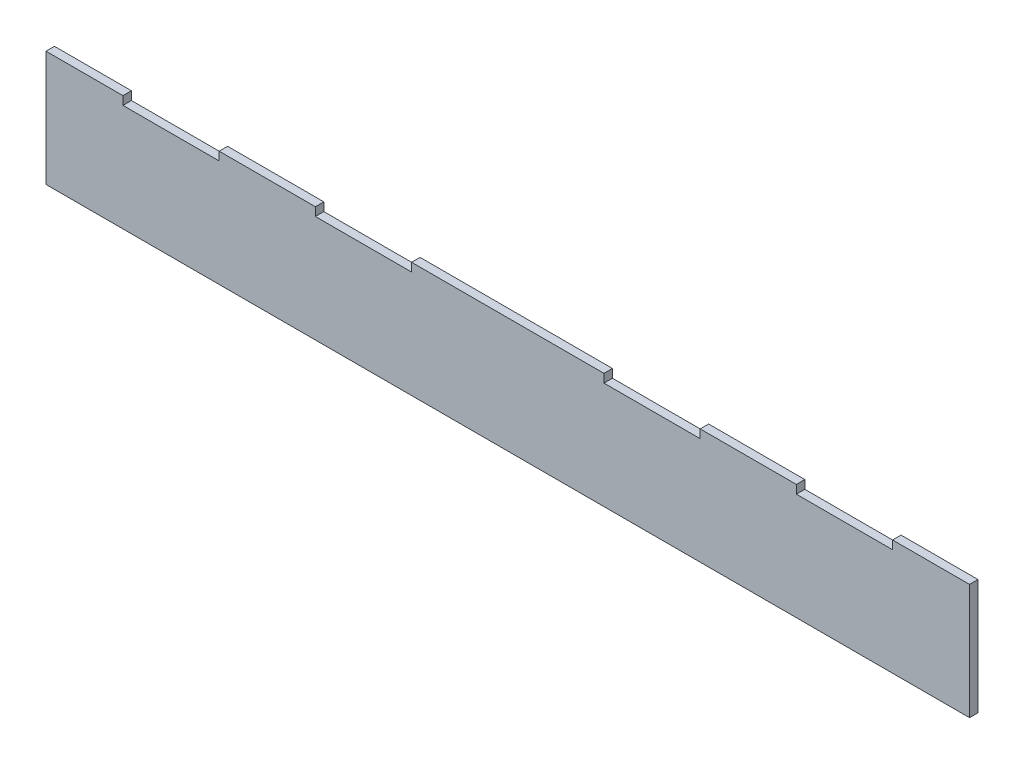
ISO-10303-21;
HEADER;
FILE_DESCRIPTION(('STEP AP214'),'2;1');
FILE_NAME('part.step','',(''),(''),'','','');
FILE_SCHEMA(('AUTOMOTIVE_DESIGN { 1 0 10303 214 1 1 1 1 }'));
ENDSEC;
DATA;
#1=APPLICATION_CONTEXT('core data for automotive mechanical design processes');
#2=APPLICATION_PROTOCOL_DEFINITION('international standard','automotive_design',2000,#1);
#3=PRODUCT_CONTEXT('',#1,'mechanical');
#4=PRODUCT('Part','Part','',(#3));
#5=PRODUCT_RELATED_PRODUCT_CATEGORY('part','',(#4));
#6=PRODUCT_DEFINITION_FORMATION('','',#4);
#7=PRODUCT_DEFINITION_CONTEXT('part definition',#1,'design');
#8=PRODUCT_DEFINITION('design','',#6,#7);
#9=PRODUCT_DEFINITION_SHAPE('','',#8);
#10=(LENGTH_UNIT() NAMED_UNIT(*) SI_UNIT(.MILLI.,.METRE.));
#11=(NAMED_UNIT(*) PLANE_ANGLE_UNIT() SI_UNIT($,.RADIAN.));
#12=(NAMED_UNIT(*) SI_UNIT($,.STERADIAN.) SOLID_ANGLE_UNIT());
#13=UNCERTAINTY_MEASURE_WITH_UNIT(LENGTH_MEASURE(1.E-05),#10,'distance_accuracy_value','');
#14=(GEOMETRIC_REPRESENTATION_CONTEXT(3) GLOBAL_UNCERTAINTY_ASSIGNED_CONTEXT((#13)) GLOBAL_UNIT_ASSIGNED_CONTEXT((#10,
#11,#12)) REPRESENTATION_CONTEXT('',''));
#15=CARTESIAN_POINT('',(0.,0.,0.));
#16=DIRECTION('',(0.,0.,1.));
#17=DIRECTION('',(1.,0.,0.));
#18=AXIS2_PLACEMENT_3D('',#15,#16,#17);
#19=CARTESIAN_POINT('',(-801.771802918118,35.9097615969068,5.588));
#20=DIRECTION('',(1.,0.,0.));
#21=DIRECTION('',(0.,0.,-1.));
#22=AXIS2_PLACEMENT_3D('',#19,#20,#21);
#23=PLANE('',#22);
#24=DIRECTION('',(0.,-1.,0.));
#25=VECTOR('',#24,1.);
#26=CARTESIAN_POINT('',(-801.771802918118,35.9097615969068,0.));
#27=LINE('',#26,#25);
#28=CARTESIAN_POINT('',(-801.771802918118,35.9097615969068,0.));
#29=VERTEX_POINT('',#28);
#30=CARTESIAN_POINT('',(-801.771802918118,-40.2902384030932,0.));
#31=VERTEX_POINT('',#30);
#32=EDGE_CURVE('E203',#29,#31,#27,.T.);
#33=ORIENTED_EDGE('',*,*,#32,.T.);
#34=DIRECTION('',(0.,0.,-1.));
#35=VECTOR('',#34,1.);
#36=CARTESIAN_POINT('',(-801.771802918118,-40.2902384030932,5.588));
#37=LINE('',#36,#35);
#38=CARTESIAN_POINT('',(-801.771802918118,-40.2902384030932,5.588));
#39=VERTEX_POINT('',#38);
#40=EDGE_CURVE('E11',#39,#31,#37,.T.);
#41=ORIENTED_EDGE('',*,*,#40,.F.);
#42=DIRECTION('',(0.,-1.,0.));
#43=VECTOR('',#42,1.);
#44=CARTESIAN_POINT('',(-801.771802918118,35.9097615969068,5.588));
#45=LINE('',#44,#43);
#46=CARTESIAN_POINT('',(-801.771802918118,35.9097615969068,5.588));
#47=VERTEX_POINT('',#46);
#48=EDGE_CURVE('E241',#47,#39,#45,.T.);
#49=ORIENTED_EDGE('',*,*,#48,.F.);
#50=DIRECTION('',(0.,0.,-1.));
#51=VECTOR('',#50,1.);
#52=CARTESIAN_POINT('',(-801.771802918118,35.9097615969068,5.588));
#53=LINE('',#52,#51);
#54=EDGE_CURVE('E199',#47,#29,#53,.T.);
#55=ORIENTED_EDGE('',*,*,#54,.T.);
#56=EDGE_LOOP('',(#33,#41,#49,#55));
#57=FACE_BOUND('',#56,.T.);
#58=ADVANCED_FACE('F35',(#57),#23,.F.);
#59=CARTESIAN_POINT('',(-801.771802918118,-40.2902384030932,5.588));
#60=DIRECTION('',(0.,1.,0.));
#61=DIRECTION('',(-1.,0.,0.));
#62=AXIS2_PLACEMENT_3D('',#59,#60,#61);
#63=PLANE('',#62);
#64=DIRECTION('',(1.,0.,0.));
#65=VECTOR('',#64,1.);
#66=CARTESIAN_POINT('',(-801.771802918118,-40.2902384030932,0.));
#67=LINE('',#66,#65);
#68=CARTESIAN_POINT('',(-192.171802918118,-40.2902384030932,0.));
#69=VERTEX_POINT('',#68);
#70=EDGE_CURVE('E206',#31,#69,#67,.T.);
#71=ORIENTED_EDGE('',*,*,#70,.T.);
#72=DIRECTION('',(0.,0.,-1.));
#73=VECTOR('',#72,1.);
#74=CARTESIAN_POINT('',(-192.171802918118,-40.2902384030932,5.588));
#75=LINE('',#74,#73);
#76=CARTESIAN_POINT('',(-192.171802918118,-40.2902384030932,5.588));
#77=VERTEX_POINT('',#76);
#78=EDGE_CURVE('E43',#77,#69,#75,.T.);
#79=ORIENTED_EDGE('',*,*,#78,.F.);
#80=DIRECTION('',(1.,0.,0.));
#81=VECTOR('',#80,1.);
#82=CARTESIAN_POINT('',(-801.771802918118,-40.2902384030932,5.588));
#83=LINE('',#82,#81);
#84=EDGE_CURVE('E130',#39,#77,#83,.T.);
#85=ORIENTED_EDGE('',*,*,#84,.F.);
#86=ORIENTED_EDGE('',*,*,#40,.T.);
#87=EDGE_LOOP('',(#71,#79,#85,#86));
#88=FACE_BOUND('',#87,.T.);
#89=ADVANCED_FACE('F359',(#88),#63,.F.);
#90=CARTESIAN_POINT('',(-192.171802918118,35.9097615969068,5.588));
#91=DIRECTION('',(-1.,0.,0.));
#92=DIRECTION('',(0.,-1.,0.));
#93=AXIS2_PLACEMENT_3D('',#90,#91,#92);
#94=PLANE('',#93);
#95=DIRECTION('',(0.,1.,0.));
#96=VECTOR('',#95,1.);
#97=CARTESIAN_POINT('',(-192.171802918118,35.9097615969068,0.));
#98=LINE('',#97,#96);
#99=CARTESIAN_POINT('',(-192.171802918118,35.9097615969068,0.));
#100=VERTEX_POINT('',#99);
#101=EDGE_CURVE('E208',#69,#100,#98,.T.);
#102=ORIENTED_EDGE('',*,*,#101,.T.);
#103=DIRECTION('',(0.,0.,-1.));
#104=VECTOR('',#103,1.);
#105=CARTESIAN_POINT('',(-192.171802918118,35.9097615969068,5.588));
#106=LINE('',#105,#104);
#107=CARTESIAN_POINT('',(-192.171802918118,35.9097615969068,5.588));
#108=VERTEX_POINT('',#107);
#109=EDGE_CURVE('E284',#108,#100,#106,.T.);
#110=ORIENTED_EDGE('',*,*,#109,.F.);
#111=DIRECTION('',(0.,1.,0.));
#112=VECTOR('',#111,1.);
#113=CARTESIAN_POINT('',(-192.171802918118,35.9097615969068,5.588));
#114=LINE('',#113,#112);
#115=EDGE_CURVE('E292',#77,#108,#114,.T.);
#116=ORIENTED_EDGE('',*,*,#115,.F.);
#117=ORIENTED_EDGE('',*,*,#78,.T.);
#118=EDGE_LOOP('',(#102,#110,#116,#117));
#119=FACE_BOUND('',#118,.T.);
#120=ADVANCED_FACE('F290',(#119),#94,.F.);
#121=CARTESIAN_POINT('',(-192.171802918118,35.9097615969068,5.588));
#122=DIRECTION('',(0.,-1.,0.));
#123=DIRECTION('',(1.,0.,0.));
#124=AXIS2_PLACEMENT_3D('',#121,#122,#123);
#125=PLANE('',#124);
#126=DIRECTION('',(-1.,0.,0.));
#127=VECTOR('',#126,1.);
#128=CARTESIAN_POINT('',(-192.171802918118,35.9097615969068,0.));
#129=LINE('',#128,#127);
#130=CARTESIAN_POINT('',(-242.971802918118,35.9097615969068,0.));
#131=VERTEX_POINT('',#130);
#132=EDGE_CURVE('E210',#100,#131,#129,.T.);
#133=ORIENTED_EDGE('',*,*,#132,.T.);
#134=DIRECTION('',(0.,0.,-1.));
#135=VECTOR('',#134,1.);
#136=CARTESIAN_POINT('',(-242.971802918118,35.9097615969068,5.588));
#137=LINE('',#136,#135);
#138=CARTESIAN_POINT('',(-242.971802918118,35.9097615969068,5.588));
#139=VERTEX_POINT('',#138);
#140=EDGE_CURVE('E281',#139,#131,#137,.T.);
#141=ORIENTED_EDGE('',*,*,#140,.F.);
#142=DIRECTION('',(-1.,0.,0.));
#143=VECTOR('',#142,1.);
#144=CARTESIAN_POINT('',(-192.171802918118,35.9097615969068,5.588));
#145=LINE('',#144,#143);
#146=EDGE_CURVE('E310',#108,#139,#145,.T.);
#147=ORIENTED_EDGE('',*,*,#146,.F.);
#148=ORIENTED_EDGE('',*,*,#109,.T.);
#149=EDGE_LOOP('',(#133,#141,#147,#148));
#150=FACE_BOUND('',#149,.T.);
#151=ADVANCED_FACE('F301',(#150),#125,.F.);
#152=CARTESIAN_POINT('',(-242.971802918118,35.9097615969068,5.588));
#153=DIRECTION('',(1.,-1.39075897859315E-13,0.));
#154=DIRECTION('',(1.39075897859315E-13,1.,0.));
#155=AXIS2_PLACEMENT_3D('',#152,#153,#154);
#156=PLANE('',#155);
#157=DIRECTION('',(-1.39075897859315E-13,-1.,0.));
#158=VECTOR('',#157,1.);
#159=CARTESIAN_POINT('',(-242.971802918118,35.9097615969068,0.));
#160=LINE('',#159,#158);
#161=CARTESIAN_POINT('',(-242.971802918119,30.3217615969085,0.));
#162=VERTEX_POINT('',#161);
#163=EDGE_CURVE('E212',#131,#162,#160,.T.);
#164=ORIENTED_EDGE('',*,*,#163,.T.);
#165=DIRECTION('',(0.,0.,-1.));
#166=VECTOR('',#165,1.);
#167=CARTESIAN_POINT('',(-242.971802918119,30.3217615969085,5.588));
#168=LINE('',#167,#166);
#169=CARTESIAN_POINT('',(-242.971802918119,30.3217615969085,5.588));
#170=VERTEX_POINT('',#169);
#171=EDGE_CURVE('E278',#170,#162,#168,.T.);
#172=ORIENTED_EDGE('',*,*,#171,.F.);
#173=DIRECTION('',(-1.39075897859315E-13,-1.,0.));
#174=VECTOR('',#173,1.);
#175=CARTESIAN_POINT('',(-242.971802918118,35.9097615969068,5.588));
#176=LINE('',#175,#174);
#177=EDGE_CURVE('E307',#139,#170,#176,.T.);
#178=ORIENTED_EDGE('',*,*,#177,.F.);
#179=ORIENTED_EDGE('',*,*,#140,.T.);
#180=EDGE_LOOP('',(#164,#172,#178,#179));
#181=FACE_BOUND('',#180,.T.);
#182=ADVANCED_FACE('F305',(#181),#156,.F.);
#183=CARTESIAN_POINT('',(-242.971802918119,30.3217615969085,5.588));
#184=DIRECTION('',(0.,-1.,0.));
#185=DIRECTION('',(1.,0.,0.));
#186=AXIS2_PLACEMENT_3D('',#183,#184,#185);
#187=PLANE('',#186);
#188=DIRECTION('',(-1.,0.,0.));
#189=VECTOR('',#188,1.);
#190=CARTESIAN_POINT('',(-242.971802918119,30.3217615969085,0.));
#191=LINE('',#190,#189);
#192=CARTESIAN_POINT('',(-306.471802918119,30.3217615969081,0.));
#193=VERTEX_POINT('',#192);
#194=EDGE_CURVE('E214',#162,#193,#191,.T.);
#195=ORIENTED_EDGE('',*,*,#194,.T.);
#196=DIRECTION('',(0.,0.,-1.));
#197=VECTOR('',#196,1.);
#198=CARTESIAN_POINT('',(-306.471802918119,30.3217615969081,5.588));
#199=LINE('',#198,#197);
#200=CARTESIAN_POINT('',(-306.471802918119,30.3217615969081,5.588));
#201=VERTEX_POINT('',#200);
#202=EDGE_CURVE('E275',#201,#193,#199,.T.);
#203=ORIENTED_EDGE('',*,*,#202,.F.);
#204=DIRECTION('',(-1.,0.,0.));
#205=VECTOR('',#204,1.);
#206=CARTESIAN_POINT('',(-242.971802918119,30.3217615969085,5.588));
#207=LINE('',#206,#205);
#208=EDGE_CURVE('E309',#170,#201,#207,.T.);
#209=ORIENTED_EDGE('',*,*,#208,.F.);
#210=ORIENTED_EDGE('',*,*,#171,.T.);
#211=EDGE_LOOP('',(#195,#203,#209,#210));
#212=FACE_BOUND('',#211,.T.);
#213=ADVANCED_FACE('F372',(#212),#187,.F.);
#214=CARTESIAN_POINT('',(-306.471802918118,35.9097615969067,5.588));
#215=DIRECTION('',(-1.,1.39075897859305E-13,0.));
#216=DIRECTION('',(-1.39075897859305E-13,-1.,0.));
#217=AXIS2_PLACEMENT_3D('',#214,#215,#216);
#218=PLANE('',#217);
#219=DIRECTION('',(1.39075897859305E-13,1.,0.));
#220=VECTOR('',#219,1.);
#221=CARTESIAN_POINT('',(-306.471802918118,35.9097615969067,0.));
#222=LINE('',#221,#220);
#223=CARTESIAN_POINT('',(-306.471802918118,35.9097615969067,0.));
#224=VERTEX_POINT('',#223);
#225=EDGE_CURVE('E216',#193,#224,#222,.T.);
#226=ORIENTED_EDGE('',*,*,#225,.T.);
#227=DIRECTION('',(0.,0.,-1.));
#228=VECTOR('',#227,1.);
#229=CARTESIAN_POINT('',(-306.471802918118,35.9097615969067,5.588));
#230=LINE('',#229,#228);
#231=CARTESIAN_POINT('',(-306.471802918118,35.9097615969067,5.588));
#232=VERTEX_POINT('',#231);
#233=EDGE_CURVE('E272',#232,#224,#230,.T.);
#234=ORIENTED_EDGE('',*,*,#233,.F.);
#235=DIRECTION('',(1.39075897859305E-13,1.,0.));
#236=VECTOR('',#235,1.);
#237=CARTESIAN_POINT('',(-306.471802918118,35.9097615969067,5.588));
#238=LINE('',#237,#236);
#239=EDGE_CURVE('E312',#201,#232,#238,.T.);
#240=ORIENTED_EDGE('',*,*,#239,.F.);
#241=ORIENTED_EDGE('',*,*,#202,.T.);
#242=EDGE_LOOP('',(#226,#234,#240,#241));
#243=FACE_BOUND('',#242,.T.);
#244=ADVANCED_FACE('F375',(#243),#218,.F.);
#245=CARTESIAN_POINT('',(-306.471802918118,35.9097615969067,5.588));
#246=DIRECTION('',(0.,-1.,0.));
#247=DIRECTION('',(1.,0.,0.));
#248=AXIS2_PLACEMENT_3D('',#245,#246,#247);
#249=PLANE('',#248);
#250=DIRECTION('',(-1.,0.,0.));
#251=VECTOR('',#250,1.);
#252=CARTESIAN_POINT('',(-306.471802918118,35.9097615969067,0.));
#253=LINE('',#252,#251);
#254=CARTESIAN_POINT('',(-369.971802918118,35.9097615969067,0.));
#255=VERTEX_POINT('',#254);
#256=EDGE_CURVE('E218',#224,#255,#253,.T.);
#257=ORIENTED_EDGE('',*,*,#256,.T.);
#258=DIRECTION('',(0.,0.,-1.));
#259=VECTOR('',#258,1.);
#260=CARTESIAN_POINT('',(-369.971802918118,35.9097615969067,5.588));
#261=LINE('',#260,#259);
#262=CARTESIAN_POINT('',(-369.971802918118,35.9097615969067,5.588));
#263=VERTEX_POINT('',#262);
#264=EDGE_CURVE('E269',#263,#255,#261,.T.);
#265=ORIENTED_EDGE('',*,*,#264,.F.);
#266=DIRECTION('',(-1.,0.,0.));
#267=VECTOR('',#266,1.);
#268=CARTESIAN_POINT('',(-306.471802918118,35.9097615969067,5.588));
#269=LINE('',#268,#267);
#270=EDGE_CURVE('E318',#232,#263,#269,.T.);
#271=ORIENTED_EDGE('',*,*,#270,.F.);
#272=ORIENTED_EDGE('',*,*,#233,.T.);
#273=EDGE_LOOP('',(#257,#265,#271,#272));
#274=FACE_BOUND('',#273,.T.);
#275=ADVANCED_FACE('F379',(#274),#249,.F.);
#276=CARTESIAN_POINT('',(-369.971802918118,35.9097615969067,5.588));
#277=DIRECTION('',(1.,-1.39075897859292E-13,0.));
#278=DIRECTION('',(1.39075897859292E-13,1.,0.));
#279=AXIS2_PLACEMENT_3D('',#276,#277,#278);
#280=PLANE('',#279);
#281=DIRECTION('',(-1.39075897859292E-13,-1.,0.));
#282=VECTOR('',#281,1.);
#283=CARTESIAN_POINT('',(-369.971802918118,35.9097615969067,0.));
#284=LINE('',#283,#282);
#285=CARTESIAN_POINT('',(-369.971802918119,30.3217615969075,0.));
#286=VERTEX_POINT('',#285);
#287=EDGE_CURVE('E220',#255,#286,#284,.T.);
#288=ORIENTED_EDGE('',*,*,#287,.T.);
#289=DIRECTION('',(0.,0.,-1.));
#290=VECTOR('',#289,1.);
#291=CARTESIAN_POINT('',(-369.971802918119,30.3217615969075,5.588));
#292=LINE('',#291,#290);
#293=CARTESIAN_POINT('',(-369.971802918119,30.3217615969075,5.588));
#294=VERTEX_POINT('',#293);
#295=EDGE_CURVE('E266',#294,#286,#292,.T.);
#296=ORIENTED_EDGE('',*,*,#295,.F.);
#297=DIRECTION('',(-1.39075897859292E-13,-1.,0.));
#298=VECTOR('',#297,1.);
#299=CARTESIAN_POINT('',(-369.971802918118,35.9097615969067,5.588));
#300=LINE('',#299,#298);
#301=EDGE_CURVE('E320',#263,#294,#300,.T.);
#302=ORIENTED_EDGE('',*,*,#301,.F.);
#303=ORIENTED_EDGE('',*,*,#264,.T.);
#304=EDGE_LOOP('',(#288,#296,#302,#303));
#305=FACE_BOUND('',#304,.T.);
#306=ADVANCED_FACE('F383',(#305),#280,.F.);
#307=CARTESIAN_POINT('',(-369.971802918119,30.3217615969075,5.588));
#308=DIRECTION('',(0.,-1.,0.));
#309=DIRECTION('',(1.,0.,0.));
#310=AXIS2_PLACEMENT_3D('',#307,#308,#309);
#311=PLANE('',#310);
#312=DIRECTION('',(-1.,0.,0.));
#313=VECTOR('',#312,1.);
#314=CARTESIAN_POINT('',(-369.971802918119,30.3217615969075,0.));
#315=LINE('',#314,#313);
#316=CARTESIAN_POINT('',(-433.471802918119,30.3217615969071,0.));
#317=VERTEX_POINT('',#316);
#318=EDGE_CURVE('E222',#286,#317,#315,.T.);
#319=ORIENTED_EDGE('',*,*,#318,.T.);
#320=DIRECTION('',(0.,0.,-1.));
#321=VECTOR('',#320,1.);
#322=CARTESIAN_POINT('',(-433.471802918119,30.3217615969071,5.588));
#323=LINE('',#322,#321);
#324=CARTESIAN_POINT('',(-433.471802918119,30.3217615969071,5.588));
#325=VERTEX_POINT('',#324);
#326=EDGE_CURVE('E263',#325,#317,#323,.T.);
#327=ORIENTED_EDGE('',*,*,#326,.F.);
#328=DIRECTION('',(-1.,0.,0.));
#329=VECTOR('',#328,1.);
#330=CARTESIAN_POINT('',(-369.971802918119,30.3217615969075,5.588));
#331=LINE('',#330,#329);
#332=EDGE_CURVE('E322',#294,#325,#331,.T.);
#333=ORIENTED_EDGE('',*,*,#332,.F.);
#334=ORIENTED_EDGE('',*,*,#295,.T.);
#335=EDGE_LOOP('',(#319,#327,#333,#334));
#336=FACE_BOUND('',#335,.T.);
#337=ADVANCED_FACE('F387',(#336),#311,.F.);
#338=CARTESIAN_POINT('',(-433.471802918118,35.9097615969066,5.588));
#339=DIRECTION('',(-1.,1.39075897859282E-13,0.));
#340=DIRECTION('',(-1.39075897859282E-13,-1.,0.));
#341=AXIS2_PLACEMENT_3D('',#338,#339,#340);
#342=PLANE('',#341);
#343=DIRECTION('',(1.39075897859282E-13,1.,0.));
#344=VECTOR('',#343,1.);
#345=CARTESIAN_POINT('',(-433.471802918118,35.9097615969066,0.));
#346=LINE('',#345,#344);
#347=CARTESIAN_POINT('',(-433.471802918118,35.9097615969066,0.));
#348=VERTEX_POINT('',#347);
#349=EDGE_CURVE('E224',#317,#348,#346,.T.);
#350=ORIENTED_EDGE('',*,*,#349,.T.);
#351=DIRECTION('',(0.,0.,-1.));
#352=VECTOR('',#351,1.);
#353=CARTESIAN_POINT('',(-433.471802918118,35.9097615969066,5.588));
#354=LINE('',#353,#352);
#355=CARTESIAN_POINT('',(-433.471802918118,35.9097615969066,5.588));
#356=VERTEX_POINT('',#355);
#357=EDGE_CURVE('E260',#356,#348,#354,.T.);
#358=ORIENTED_EDGE('',*,*,#357,.F.);
#359=DIRECTION('',(1.39075897859282E-13,1.,0.));
#360=VECTOR('',#359,1.);
#361=CARTESIAN_POINT('',(-433.471802918118,35.9097615969066,5.588));
#362=LINE('',#361,#360);
#363=EDGE_CURVE('E324',#325,#356,#362,.T.);
#364=ORIENTED_EDGE('',*,*,#363,.F.);
#365=ORIENTED_EDGE('',*,*,#326,.T.);
#366=EDGE_LOOP('',(#350,#358,#364,#365));
#367=FACE_BOUND('',#366,.T.);
#368=ADVANCED_FACE('F391',(#367),#342,.F.);
#369=CARTESIAN_POINT('',(-560.471802918118,35.9097615969066,5.588));
#370=DIRECTION('',(0.,-1.,0.));
#371=DIRECTION('',(1.,0.,0.));
#372=AXIS2_PLACEMENT_3D('',#369,#370,#371);
#373=PLANE('',#372);
#374=DIRECTION('',(-1.,0.,0.));
#375=VECTOR('',#374,1.);
#376=CARTESIAN_POINT('',(-560.471802918118,35.9097615969066,0.));
#377=LINE('',#376,#375);
#378=CARTESIAN_POINT('',(-560.471802918118,35.9097615969066,0.));
#379=VERTEX_POINT('',#378);
#380=EDGE_CURVE('E226',#348,#379,#377,.T.);
#381=ORIENTED_EDGE('',*,*,#380,.T.);
#382=DIRECTION('',(0.,0.,-1.));
#383=VECTOR('',#382,1.);
#384=CARTESIAN_POINT('',(-560.471802918118,35.9097615969066,5.588));
#385=LINE('',#384,#383);
#386=CARTESIAN_POINT('',(-560.471802918118,35.9097615969066,5.588));
#387=VERTEX_POINT('',#386);
#388=EDGE_CURVE('E257',#387,#379,#385,.T.);
#389=ORIENTED_EDGE('',*,*,#388,.F.);
#390=DIRECTION('',(-1.,0.,0.));
#391=VECTOR('',#390,1.);
#392=CARTESIAN_POINT('',(-560.471802918118,35.9097615969066,5.588));
#393=LINE('',#392,#391);
#394=EDGE_CURVE('E326',#356,#387,#393,.T.);
#395=ORIENTED_EDGE('',*,*,#394,.F.);
#396=ORIENTED_EDGE('',*,*,#357,.T.);
#397=EDGE_LOOP('',(#381,#389,#395,#396));
#398=FACE_BOUND('',#397,.T.);
#399=ADVANCED_FACE('F395',(#398),#373,.F.);
#400=CARTESIAN_POINT('',(-560.471802918118,35.9097615969066,5.588));
#401=DIRECTION('',(1.,0.,0.));
#402=DIRECTION('',(0.,0.,-1.));
#403=AXIS2_PLACEMENT_3D('',#400,#401,#402);
#404=PLANE('',#403);
#405=DIRECTION('',(0.,-1.,0.));
#406=VECTOR('',#405,1.);
#407=CARTESIAN_POINT('',(-560.471802918118,35.9097615969066,0.));
#408=LINE('',#407,#406);
#409=CARTESIAN_POINT('',(-560.471802918118,30.3217615969066,0.));
#410=VERTEX_POINT('',#409);
#411=EDGE_CURVE('E228',#379,#410,#408,.T.);
#412=ORIENTED_EDGE('',*,*,#411,.T.);
#413=DIRECTION('',(0.,0.,-1.));
#414=VECTOR('',#413,1.);
#415=CARTESIAN_POINT('',(-560.471802918118,30.3217615969066,5.588));
#416=LINE('',#415,#414);
#417=CARTESIAN_POINT('',(-560.471802918118,30.3217615969066,5.588));
#418=VERTEX_POINT('',#417);
#419=EDGE_CURVE('E254',#418,#410,#416,.T.);
#420=ORIENTED_EDGE('',*,*,#419,.F.);
#421=DIRECTION('',(0.,-1.,0.));
#422=VECTOR('',#421,1.);
#423=CARTESIAN_POINT('',(-560.471802918118,35.9097615969066,5.588));
#424=LINE('',#423,#422);
#425=EDGE_CURVE('E328',#387,#418,#424,.T.);
#426=ORIENTED_EDGE('',*,*,#425,.F.);
#427=ORIENTED_EDGE('',*,*,#388,.T.);
#428=EDGE_LOOP('',(#412,#420,#426,#427));
#429=FACE_BOUND('',#428,.T.);
#430=ADVANCED_FACE('F399',(#429),#404,.F.);
#431=CARTESIAN_POINT('',(-623.971802918118,30.3217615969066,5.588));
#432=DIRECTION('',(0.,-1.,0.));
#433=DIRECTION('',(1.,0.,0.));
#434=AXIS2_PLACEMENT_3D('',#431,#432,#433);
#435=PLANE('',#434);
#436=DIRECTION('',(-1.,0.,0.));
#437=VECTOR('',#436,1.);
#438=CARTESIAN_POINT('',(-623.971802918118,30.3217615969066,0.));
#439=LINE('',#438,#437);
#440=CARTESIAN_POINT('',(-623.971802918118,30.3217615969066,0.));
#441=VERTEX_POINT('',#440);
#442=EDGE_CURVE('E230',#410,#441,#439,.T.);
#443=ORIENTED_EDGE('',*,*,#442,.T.);
#444=DIRECTION('',(0.,0.,-1.));
#445=VECTOR('',#444,1.);
#446=CARTESIAN_POINT('',(-623.971802918118,30.3217615969066,5.588));
#447=LINE('',#446,#445);
#448=CARTESIAN_POINT('',(-623.971802918118,30.3217615969066,5.588));
#449=VERTEX_POINT('',#448);
#450=EDGE_CURVE('E251',#449,#441,#447,.T.);
#451=ORIENTED_EDGE('',*,*,#450,.F.);
#452=DIRECTION('',(-1.,0.,0.));
#453=VECTOR('',#452,1.);
#454=CARTESIAN_POINT('',(-623.971802918118,30.3217615969066,5.588));
#455=LINE('',#454,#453);
#456=EDGE_CURVE('E330',#418,#449,#455,.T.);
#457=ORIENTED_EDGE('',*,*,#456,.F.);
#458=ORIENTED_EDGE('',*,*,#419,.T.);
#459=EDGE_LOOP('',(#443,#451,#457,#458));
#460=FACE_BOUND('',#459,.T.);
#461=ADVANCED_FACE('F403',(#460),#435,.F.);
#462=CARTESIAN_POINT('',(-623.971802918118,35.9097615969067,5.588));
#463=DIRECTION('',(-1.,0.,0.));
#464=DIRECTION('',(0.,0.,1.));
#465=AXIS2_PLACEMENT_3D('',#462,#463,#464);
#466=PLANE('',#465);
#467=DIRECTION('',(0.,1.,0.));
#468=VECTOR('',#467,1.);
#469=CARTESIAN_POINT('',(-623.971802918118,35.9097615969067,0.));
#470=LINE('',#469,#468);
#471=CARTESIAN_POINT('',(-623.971802918118,35.9097615969067,0.));
#472=VERTEX_POINT('',#471);
#473=EDGE_CURVE('E232',#441,#472,#470,.T.);
#474=ORIENTED_EDGE('',*,*,#473,.T.);
#475=DIRECTION('',(0.,0.,-1.));
#476=VECTOR('',#475,1.);
#477=CARTESIAN_POINT('',(-623.971802918118,35.9097615969067,5.588));
#478=LINE('',#477,#476);
#479=CARTESIAN_POINT('',(-623.971802918118,35.9097615969067,5.588));
#480=VERTEX_POINT('',#479);
#481=EDGE_CURVE('E248',#480,#472,#478,.T.);
#482=ORIENTED_EDGE('',*,*,#481,.F.);
#483=DIRECTION('',(0.,1.,0.));
#484=VECTOR('',#483,1.);
#485=CARTESIAN_POINT('',(-623.971802918118,35.9097615969067,5.588));
#486=LINE('',#485,#484);
#487=EDGE_CURVE('E332',#449,#480,#486,.T.);
#488=ORIENTED_EDGE('',*,*,#487,.F.);
#489=ORIENTED_EDGE('',*,*,#450,.T.);
#490=EDGE_LOOP('',(#474,#482,#488,#489));
#491=FACE_BOUND('',#490,.T.);
#492=ADVANCED_FACE('F407',(#491),#466,.F.);
#493=CARTESIAN_POINT('',(-687.471802918118,35.9097615969067,5.588));
#494=DIRECTION('',(0.,-1.,0.));
#495=DIRECTION('',(1.,0.,0.));
#496=AXIS2_PLACEMENT_3D('',#493,#494,#495);
#497=PLANE('',#496);
#498=DIRECTION('',(-1.,0.,0.));
#499=VECTOR('',#498,1.);
#500=CARTESIAN_POINT('',(-687.471802918118,35.9097615969067,0.));
#501=LINE('',#500,#499);
#502=CARTESIAN_POINT('',(-687.471802918118,35.9097615969067,0.));
#503=VERTEX_POINT('',#502);
#504=EDGE_CURVE('E234',#472,#503,#501,.T.);
#505=ORIENTED_EDGE('',*,*,#504,.T.);
#506=DIRECTION('',(0.,0.,-1.));
#507=VECTOR('',#506,1.);
#508=CARTESIAN_POINT('',(-687.471802918118,35.9097615969067,5.588));
#509=LINE('',#508,#507);
#510=CARTESIAN_POINT('',(-687.471802918118,35.9097615969067,5.588));
#511=VERTEX_POINT('',#510);
#512=EDGE_CURVE('E245',#511,#503,#509,.T.);
#513=ORIENTED_EDGE('',*,*,#512,.F.);
#514=DIRECTION('',(-1.,0.,0.));
#515=VECTOR('',#514,1.);
#516=CARTESIAN_POINT('',(-687.471802918118,35.9097615969067,5.588));
#517=LINE('',#516,#515);
#518=EDGE_CURVE('E334',#480,#511,#517,.T.);
#519=ORIENTED_EDGE('',*,*,#518,.F.);
#520=ORIENTED_EDGE('',*,*,#481,.T.);
#521=EDGE_LOOP('',(#505,#513,#519,#520));
#522=FACE_BOUND('',#521,.T.);
#523=ADVANCED_FACE('F340',(#522),#497,.F.);
#524=CARTESIAN_POINT('',(-687.471802918118,35.9097615969067,5.588));
#525=DIRECTION('',(1.,0.,0.));
#526=DIRECTION('',(0.,0.,-1.));
#527=AXIS2_PLACEMENT_3D('',#524,#525,#526);
#528=PLANE('',#527);
#529=DIRECTION('',(0.,-1.,0.));
#530=VECTOR('',#529,1.);
#531=CARTESIAN_POINT('',(-687.471802918118,35.9097615969067,0.));
#532=LINE('',#531,#530);
#533=CARTESIAN_POINT('',(-687.471802918118,30.3217615969067,0.));
#534=VERTEX_POINT('',#533);
#535=EDGE_CURVE('E236',#503,#534,#532,.T.);
#536=ORIENTED_EDGE('',*,*,#535,.T.);
#537=DIRECTION('',(0.,0.,-1.));
#538=VECTOR('',#537,1.);
#539=CARTESIAN_POINT('',(-687.471802918118,30.3217615969067,5.588));
#540=LINE('',#539,#538);
#541=CARTESIAN_POINT('',(-687.471802918118,30.3217615969067,5.588));
#542=VERTEX_POINT('',#541);
#543=EDGE_CURVE('E194',#542,#534,#540,.T.);
#544=ORIENTED_EDGE('',*,*,#543,.F.);
#545=DIRECTION('',(0.,-1.,0.));
#546=VECTOR('',#545,1.);
#547=CARTESIAN_POINT('',(-687.471802918118,35.9097615969067,5.588));
#548=LINE('',#547,#546);
#549=EDGE_CURVE('E185',#511,#542,#548,.T.);
#550=ORIENTED_EDGE('',*,*,#549,.F.);
#551=ORIENTED_EDGE('',*,*,#512,.T.);
#552=EDGE_LOOP('',(#536,#544,#550,#551));
#553=FACE_BOUND('',#552,.T.);
#554=ADVANCED_FACE('F344',(#553),#528,.F.);
#555=CARTESIAN_POINT('',(-750.971802918118,30.3217615969067,5.588));
#556=DIRECTION('',(0.,-1.,0.));
#557=DIRECTION('',(0.,0.,-1.));
#558=AXIS2_PLACEMENT_3D('',#555,#556,#557);
#559=PLANE('',#558);
#560=DIRECTION('',(-1.,0.,0.));
#561=VECTOR('',#560,1.);
#562=CARTESIAN_POINT('',(-750.971802918118,30.3217615969067,0.));
#563=LINE('',#562,#561);
#564=CARTESIAN_POINT('',(-750.971802918118,30.3217615969067,0.));
#565=VERTEX_POINT('',#564);
#566=EDGE_CURVE('E193',#534,#565,#563,.T.);
#567=ORIENTED_EDGE('',*,*,#566,.T.);
#568=DIRECTION('',(0.,0.,-1.));
#569=VECTOR('',#568,1.);
#570=CARTESIAN_POINT('',(-750.971802918118,30.3217615969067,5.588));
#571=LINE('',#570,#569);
#572=CARTESIAN_POINT('',(-750.971802918118,30.3217615969067,5.588));
#573=VERTEX_POINT('',#572);
#574=EDGE_CURVE('E190',#573,#565,#571,.T.);
#575=ORIENTED_EDGE('',*,*,#574,.F.);
#576=DIRECTION('',(-1.,0.,0.));
#577=VECTOR('',#576,1.);
#578=CARTESIAN_POINT('',(-750.971802918118,30.3217615969067,5.588));
#579=LINE('',#578,#577);
#580=EDGE_CURVE('E179',#542,#573,#579,.T.);
#581=ORIENTED_EDGE('',*,*,#580,.F.);
#582=ORIENTED_EDGE('',*,*,#543,.T.);
#583=EDGE_LOOP('',(#567,#575,#581,#582));
#584=FACE_BOUND('',#583,.T.);
#585=ADVANCED_FACE('F191',(#584),#559,.F.);
#586=CARTESIAN_POINT('',(-750.971802918118,35.9097615969067,5.588));
#587=DIRECTION('',(-1.,0.,0.));
#588=DIRECTION('',(0.,0.,1.));
#589=AXIS2_PLACEMENT_3D('',#586,#587,#588);
#590=PLANE('',#589);
#591=DIRECTION('',(0.,1.,0.));
#592=VECTOR('',#591,1.);
#593=CARTESIAN_POINT('',(-750.971802918118,35.9097615969067,0.));
#594=LINE('',#593,#592);
#595=CARTESIAN_POINT('',(-750.971802918118,35.9097615969067,0.));
#596=VERTEX_POINT('',#595);
#597=EDGE_CURVE('E116',#565,#596,#594,.T.);
#598=ORIENTED_EDGE('',*,*,#597,.T.);
#599=DIRECTION('',(0.,0.,-1.));
#600=VECTOR('',#599,1.);
#601=CARTESIAN_POINT('',(-750.971802918118,35.9097615969067,5.588));
#602=LINE('',#601,#600);
#603=CARTESIAN_POINT('',(-750.971802918118,35.9097615969067,5.588));
#604=VERTEX_POINT('',#603);
#605=EDGE_CURVE('E195',#604,#596,#602,.T.);
#606=ORIENTED_EDGE('',*,*,#605,.F.);
#607=DIRECTION('',(0.,1.,0.));
#608=VECTOR('',#607,1.);
#609=CARTESIAN_POINT('',(-750.971802918118,35.9097615969067,5.588));
#610=LINE('',#609,#608);
#611=EDGE_CURVE('E183',#573,#604,#610,.T.);
#612=ORIENTED_EDGE('',*,*,#611,.F.);
#613=ORIENTED_EDGE('',*,*,#574,.T.);
#614=EDGE_LOOP('',(#598,#606,#612,#613));
#615=FACE_BOUND('',#614,.T.);
#616=ADVANCED_FACE('F197',(#615),#590,.F.);
#617=CARTESIAN_POINT('',(-801.771802918118,35.9097615969068,5.588));
#618=DIRECTION('',(0.,-1.,0.));
#619=DIRECTION('',(1.,0.,0.));
#620=AXIS2_PLACEMENT_3D('',#617,#618,#619);
#621=PLANE('',#620);
#622=DIRECTION('',(-1.,0.,0.));
#623=VECTOR('',#622,1.);
#624=CARTESIAN_POINT('',(-801.771802918118,35.9097615969068,0.));
#625=LINE('',#624,#623);
#626=EDGE_CURVE('E122',#596,#29,#625,.T.);
#627=ORIENTED_EDGE('',*,*,#626,.T.);
#628=ORIENTED_EDGE('',*,*,#54,.F.);
#629=DIRECTION('',(-1.,0.,0.));
#630=VECTOR('',#629,1.);
#631=CARTESIAN_POINT('',(-801.771802918118,35.9097615969068,5.588));
#632=LINE('',#631,#630);
#633=EDGE_CURVE('E51',#604,#47,#632,.T.);
#634=ORIENTED_EDGE('',*,*,#633,.F.);
#635=ORIENTED_EDGE('',*,*,#605,.T.);
#636=EDGE_LOOP('',(#627,#628,#634,#635));
#637=FACE_BOUND('',#636,.T.);
#638=ADVANCED_FACE('F348',(#637),#621,.F.);
#639=CARTESIAN_POINT('',(0.,0.,5.588));
#640=DIRECTION('',(0.,0.,1.));
#641=DIRECTION('',(1.,0.,0.));
#642=AXIS2_PLACEMENT_3D('',#639,#640,#641);
#643=PLANE('',#642);
#644=ORIENTED_EDGE('',*,*,#48,.T.);
#645=ORIENTED_EDGE('',*,*,#84,.T.);
#646=ORIENTED_EDGE('',*,*,#115,.T.);
#647=ORIENTED_EDGE('',*,*,#146,.T.);
#648=ORIENTED_EDGE('',*,*,#177,.T.);
#649=ORIENTED_EDGE('',*,*,#208,.T.);
#650=ORIENTED_EDGE('',*,*,#239,.T.);
#651=ORIENTED_EDGE('',*,*,#270,.T.);
#652=ORIENTED_EDGE('',*,*,#301,.T.);
#653=ORIENTED_EDGE('',*,*,#332,.T.);
#654=ORIENTED_EDGE('',*,*,#363,.T.);
#655=ORIENTED_EDGE('',*,*,#394,.T.);
#656=ORIENTED_EDGE('',*,*,#425,.T.);
#657=ORIENTED_EDGE('',*,*,#456,.T.);
#658=ORIENTED_EDGE('',*,*,#487,.T.);
#659=ORIENTED_EDGE('',*,*,#518,.T.);
#660=ORIENTED_EDGE('',*,*,#549,.T.);
#661=ORIENTED_EDGE('',*,*,#580,.T.);
#662=ORIENTED_EDGE('',*,*,#611,.T.);
#663=ORIENTED_EDGE('',*,*,#633,.T.);
#664=EDGE_LOOP('',(#644,#645,#646,#647,#648,#649,#650,#651,#652,#653,#654,#655,#656,#657,#658,
#659,#660,#661,#662,#663));
#665=FACE_BOUND('',#664,.T.);
#666=ADVANCED_FACE('F181',(#665),#643,.T.);
#667=CARTESIAN_POINT('',(0.,0.,0.));
#668=DIRECTION('',(0.,0.,1.));
#669=DIRECTION('',(1.,0.,0.));
#670=AXIS2_PLACEMENT_3D('',#667,#668,#669);
#671=PLANE('',#670);
#672=ORIENTED_EDGE('',*,*,#32,.F.);
#673=ORIENTED_EDGE('',*,*,#626,.F.);
#674=ORIENTED_EDGE('',*,*,#597,.F.);
#675=ORIENTED_EDGE('',*,*,#566,.F.);
#676=ORIENTED_EDGE('',*,*,#535,.F.);
#677=ORIENTED_EDGE('',*,*,#504,.F.);
#678=ORIENTED_EDGE('',*,*,#473,.F.);
#679=ORIENTED_EDGE('',*,*,#442,.F.);
#680=ORIENTED_EDGE('',*,*,#411,.F.);
#681=ORIENTED_EDGE('',*,*,#380,.F.);
#682=ORIENTED_EDGE('',*,*,#349,.F.);
#683=ORIENTED_EDGE('',*,*,#318,.F.);
#684=ORIENTED_EDGE('',*,*,#287,.F.);
#685=ORIENTED_EDGE('',*,*,#256,.F.);
#686=ORIENTED_EDGE('',*,*,#225,.F.);
#687=ORIENTED_EDGE('',*,*,#194,.F.);
#688=ORIENTED_EDGE('',*,*,#163,.F.);
#689=ORIENTED_EDGE('',*,*,#132,.F.);
#690=ORIENTED_EDGE('',*,*,#101,.F.);
#691=ORIENTED_EDGE('',*,*,#70,.F.);
#692=EDGE_LOOP('',(#672,#673,#674,#675,#676,#677,#678,#679,#680,#681,#682,#683,#684,#685,#686,
#687,#688,#689,#690,#691));
#693=FACE_BOUND('',#692,.T.);
#694=ADVANCED_FACE('F296',(#693),#671,.F.);
#695=CLOSED_SHELL('',(#58,#89,#120,#151,#182,#213,#244,#275,#306,#337,#368,#399,#430,#461,#492,
#523,#554,#585,#616,#638,#666,#694));
#696=MANIFOLD_SOLID_BREP('B2',#695);
#697=ADVANCED_BREP_SHAPE_REPRESENTATION('',(#18,#696),#14);
#698=SHAPE_DEFINITION_REPRESENTATION(#9,#697);
ENDSEC;
END-ISO-10303-21;
